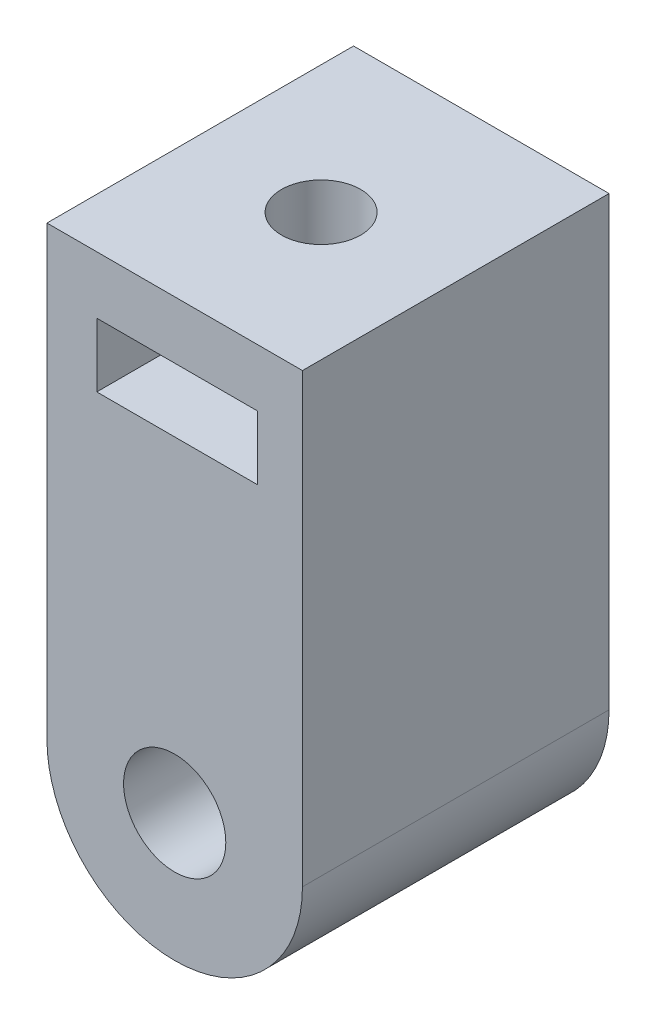
ISO-10303-21;
HEADER;
FILE_DESCRIPTION(('STEP AP214'),'2;1');
FILE_NAME('part.step','',(''),(''),'','','');
FILE_SCHEMA(('AUTOMOTIVE_DESIGN { 1 0 10303 214 1 1 1 1 }'));
ENDSEC;
DATA;
#1=APPLICATION_CONTEXT('core data for automotive mechanical design processes');
#2=APPLICATION_PROTOCOL_DEFINITION('international standard','automotive_design',2000,#1);
#3=PRODUCT_CONTEXT('',#1,'mechanical');
#4=PRODUCT('Part','Part','',(#3));
#5=PRODUCT_RELATED_PRODUCT_CATEGORY('part','',(#4));
#6=PRODUCT_DEFINITION_FORMATION('','',#4);
#7=PRODUCT_DEFINITION_CONTEXT('part definition',#1,'design');
#8=PRODUCT_DEFINITION('design','',#6,#7);
#9=PRODUCT_DEFINITION_SHAPE('','',#8);
#10=(LENGTH_UNIT() NAMED_UNIT(*) SI_UNIT(.MILLI.,.METRE.));
#11=(NAMED_UNIT(*) PLANE_ANGLE_UNIT() SI_UNIT($,.RADIAN.));
#12=(NAMED_UNIT(*) SI_UNIT($,.STERADIAN.) SOLID_ANGLE_UNIT());
#13=UNCERTAINTY_MEASURE_WITH_UNIT(LENGTH_MEASURE(1.E-05),#10,'distance_accuracy_value','');
#14=(GEOMETRIC_REPRESENTATION_CONTEXT(3) GLOBAL_UNCERTAINTY_ASSIGNED_CONTEXT((#13)) GLOBAL_UNIT_ASSIGNED_CONTEXT((#10,
#11,#12)) REPRESENTATION_CONTEXT('',''));
#15=CARTESIAN_POINT('',(0.,0.,0.));
#16=DIRECTION('',(0.,0.,1.));
#17=DIRECTION('',(1.,0.,0.));
#18=AXIS2_PLACEMENT_3D('',#15,#16,#17);
#19=CARTESIAN_POINT('',(0.,0.,12.));
#20=DIRECTION('',(0.,0.,1.));
#21=DIRECTION('',(1.,0.,0.));
#22=AXIS2_PLACEMENT_3D('',#19,#20,#21);
#23=PLANE('',#22);
#24=DIRECTION('',(0.,-1.,0.));
#25=VECTOR('',#24,1.);
#26=CARTESIAN_POINT('',(-3.05,15.25,12.));
#27=LINE('',#26,#25);
#28=CARTESIAN_POINT('',(-3.05,15.25,12.));
#29=VERTEX_POINT('',#28);
#30=CARTESIAN_POINT('',(-3.05,12.75,12.));
#31=VERTEX_POINT('',#30);
#32=EDGE_CURVE('E58',#29,#31,#27,.T.);
#33=ORIENTED_EDGE('',*,*,#32,.F.);
#34=DIRECTION('',(-1.,0.,0.));
#35=VECTOR('',#34,1.);
#36=CARTESIAN_POINT('',(3.25,15.25,12.));
#37=LINE('',#36,#35);
#38=CARTESIAN_POINT('',(3.25,15.25,12.));
#39=VERTEX_POINT('',#38);
#40=EDGE_CURVE('E169',#39,#29,#37,.T.);
#41=ORIENTED_EDGE('',*,*,#40,.F.);
#42=DIRECTION('',(0.,1.,0.));
#43=VECTOR('',#42,1.);
#44=CARTESIAN_POINT('',(3.25,15.25,12.));
#45=LINE('',#44,#43);
#46=CARTESIAN_POINT('',(3.25,12.75,12.));
#47=VERTEX_POINT('',#46);
#48=EDGE_CURVE('E183',#47,#39,#45,.T.);
#49=ORIENTED_EDGE('',*,*,#48,.F.);
#50=DIRECTION('',(1.,0.,0.));
#51=VECTOR('',#50,1.);
#52=CARTESIAN_POINT('',(3.25,12.75,12.));
#53=LINE('',#52,#51);
#54=EDGE_CURVE('E180',#31,#47,#53,.T.);
#55=ORIENTED_EDGE('',*,*,#54,.F.);
#56=EDGE_LOOP('',(#33,#41,#49,#55));
#57=FACE_BOUND('',#56,.T.);
#58=CARTESIAN_POINT('',(0.,0.,12.));
#59=DIRECTION('',(0.,0.,1.));
#60=DIRECTION('',(1.,0.,0.));
#61=AXIS2_PLACEMENT_3D('',#58,#59,#60);
#62=CIRCLE('',#61,2.);
#63=CARTESIAN_POINT('',(2.,0.,12.));
#64=VERTEX_POINT('',#63);
#65=EDGE_CURVE('E221',#64,#64,#62,.T.);
#66=ORIENTED_EDGE('',*,*,#65,.F.);
#67=EDGE_LOOP('',(#66));
#68=FACE_BOUND('',#67,.T.);
#69=DIRECTION('',(0.,-1.,0.));
#70=VECTOR('',#69,1.);
#71=CARTESIAN_POINT('',(-5.,0.,12.));
#72=LINE('',#71,#70);
#73=CARTESIAN_POINT('',(-5.,17.5,12.));
#74=VERTEX_POINT('',#73);
#75=CARTESIAN_POINT('',(-5.,0.,12.));
#76=VERTEX_POINT('',#75);
#77=EDGE_CURVE('E208',#74,#76,#72,.T.);
#78=ORIENTED_EDGE('',*,*,#77,.T.);
#79=CARTESIAN_POINT('',(0.,0.,12.));
#80=DIRECTION('',(0.,0.,1.));
#81=DIRECTION('',(1.,0.,0.));
#82=AXIS2_PLACEMENT_3D('',#79,#80,#81);
#83=CIRCLE('',#82,5.);
#84=CARTESIAN_POINT('',(5.,0.,12.));
#85=VERTEX_POINT('',#84);
#86=EDGE_CURVE('E11',#76,#85,#83,.T.);
#87=ORIENTED_EDGE('',*,*,#86,.T.);
#88=DIRECTION('',(0.,1.,0.));
#89=VECTOR('',#88,1.);
#90=CARTESIAN_POINT('',(5.,0.,12.));
#91=LINE('',#90,#89);
#92=CARTESIAN_POINT('',(5.,17.5,12.));
#93=VERTEX_POINT('',#92);
#94=EDGE_CURVE('E190',#85,#93,#91,.T.);
#95=ORIENTED_EDGE('',*,*,#94,.T.);
#96=DIRECTION('',(-1.,0.,0.));
#97=VECTOR('',#96,1.);
#98=CARTESIAN_POINT('',(-5.,17.5,12.));
#99=LINE('',#98,#97);
#100=EDGE_CURVE('E205',#93,#74,#99,.T.);
#101=ORIENTED_EDGE('',*,*,#100,.T.);
#102=EDGE_LOOP('',(#78,#87,#95,#101));
#103=FACE_BOUND('',#102,.T.);
#104=ADVANCED_FACE('F35',(#57,#68,#103),#23,.T.);
#105=CARTESIAN_POINT('',(0.,0.,0.));
#106=DIRECTION('',(0.,0.,1.));
#107=DIRECTION('',(1.,0.,0.));
#108=AXIS2_PLACEMENT_3D('',#105,#106,#107);
#109=PLANE('',#108);
#110=CARTESIAN_POINT('',(0.,0.,0.));
#111=DIRECTION('',(0.,0.,1.));
#112=DIRECTION('',(1.,0.,0.));
#113=AXIS2_PLACEMENT_3D('',#110,#111,#112);
#114=CIRCLE('',#113,2.);
#115=CARTESIAN_POINT('',(2.,0.,0.));
#116=VERTEX_POINT('',#115);
#117=EDGE_CURVE('E220',#116,#116,#114,.T.);
#118=ORIENTED_EDGE('',*,*,#117,.T.);
#119=EDGE_LOOP('',(#118));
#120=FACE_BOUND('',#119,.T.);
#121=CARTESIAN_POINT('',(0.,0.,0.));
#122=DIRECTION('',(0.,0.,1.));
#123=DIRECTION('',(1.,0.,0.));
#124=AXIS2_PLACEMENT_3D('',#121,#122,#123);
#125=CIRCLE('',#124,5.);
#126=CARTESIAN_POINT('',(-5.,0.,0.));
#127=VERTEX_POINT('',#126);
#128=CARTESIAN_POINT('',(5.,0.,0.));
#129=VERTEX_POINT('',#128);
#130=EDGE_CURVE('E39',#127,#129,#125,.T.);
#131=ORIENTED_EDGE('',*,*,#130,.F.);
#132=DIRECTION('',(0.,1.,0.));
#133=VECTOR('',#132,1.);
#134=CARTESIAN_POINT('',(-5.,0.,0.));
#135=LINE('',#134,#133);
#136=CARTESIAN_POINT('',(-5.,17.5,0.));
#137=VERTEX_POINT('',#136);
#138=EDGE_CURVE('E196',#127,#137,#135,.T.);
#139=ORIENTED_EDGE('',*,*,#138,.T.);
#140=DIRECTION('',(1.,0.,0.));
#141=VECTOR('',#140,1.);
#142=CARTESIAN_POINT('',(-5.,17.5,0.));
#143=LINE('',#142,#141);
#144=CARTESIAN_POINT('',(5.,17.5,0.));
#145=VERTEX_POINT('',#144);
#146=EDGE_CURVE('E202',#137,#145,#143,.T.);
#147=ORIENTED_EDGE('',*,*,#146,.T.);
#148=DIRECTION('',(0.,-1.,0.));
#149=VECTOR('',#148,1.);
#150=CARTESIAN_POINT('',(5.,0.,0.));
#151=LINE('',#150,#149);
#152=EDGE_CURVE('E198',#145,#129,#151,.T.);
#153=ORIENTED_EDGE('',*,*,#152,.T.);
#154=EDGE_LOOP('',(#131,#139,#147,#153));
#155=FACE_BOUND('',#154,.T.);
#156=ADVANCED_FACE('F227',(#120,#155),#109,.F.);
#157=CARTESIAN_POINT('',(0.,0.,12.));
#158=DIRECTION('',(0.,0.,-1.));
#159=DIRECTION('',(-1.,0.,0.));
#160=AXIS2_PLACEMENT_3D('',#157,#158,#159);
#161=CYLINDRICAL_SURFACE('',#160,5.);
#162=ORIENTED_EDGE('',*,*,#130,.T.);
#163=DIRECTION('',(0.,0.,1.));
#164=VECTOR('',#163,1.);
#165=CARTESIAN_POINT('',(5.,0.,-20.1556443707464));
#166=LINE('',#165,#164);
#167=EDGE_CURVE('E199',#129,#85,#166,.T.);
#168=ORIENTED_EDGE('',*,*,#167,.T.);
#169=ORIENTED_EDGE('',*,*,#86,.F.);
#170=DIRECTION('',(0.,0.,1.));
#171=VECTOR('',#170,1.);
#172=CARTESIAN_POINT('',(-5.,0.,-20.1556443707464));
#173=LINE('',#172,#171);
#174=EDGE_CURVE('E213',#127,#76,#173,.T.);
#175=ORIENTED_EDGE('',*,*,#174,.F.);
#176=EDGE_LOOP('',(#162,#168,#169,#175));
#177=FACE_BOUND('',#176,.T.);
#178=ADVANCED_FACE('F37',(#177),#161,.T.);
#179=CARTESIAN_POINT('',(0.,0.,12.));
#180=DIRECTION('',(0.,0.,-1.));
#181=DIRECTION('',(-1.,0.,0.));
#182=AXIS2_PLACEMENT_3D('',#179,#180,#181);
#183=CYLINDRICAL_SURFACE('',#182,2.);
#184=ORIENTED_EDGE('',*,*,#65,.T.);
#185=EDGE_LOOP('',(#184));
#186=FACE_BOUND('',#185,.T.);
#187=ORIENTED_EDGE('',*,*,#117,.F.);
#188=EDGE_LOOP('',(#187));
#189=FACE_BOUND('',#188,.T.);
#190=ADVANCED_FACE('F230',(#186,#189),#183,.F.);
#191=CARTESIAN_POINT('',(5.,0.,-20.1556443707464));
#192=DIRECTION('',(1.,0.,0.));
#193=DIRECTION('',(0.,1.,0.));
#194=AXIS2_PLACEMENT_3D('',#191,#192,#193);
#195=PLANE('',#194);
#196=ORIENTED_EDGE('',*,*,#152,.F.);
#197=DIRECTION('',(0.,0.,1.));
#198=VECTOR('',#197,1.);
#199=CARTESIAN_POINT('',(5.,17.5,-20.1556443707464));
#200=LINE('',#199,#198);
#201=EDGE_CURVE('E211',#145,#93,#200,.T.);
#202=ORIENTED_EDGE('',*,*,#201,.T.);
#203=ORIENTED_EDGE('',*,*,#94,.F.);
#204=ORIENTED_EDGE('',*,*,#167,.F.);
#205=EDGE_LOOP('',(#196,#202,#203,#204));
#206=FACE_BOUND('',#205,.T.);
#207=ADVANCED_FACE('F232',(#206),#195,.T.);
#208=CARTESIAN_POINT('',(-5.,0.,-20.1556443707464));
#209=DIRECTION('',(-1.,0.,0.));
#210=DIRECTION('',(0.,0.,1.));
#211=AXIS2_PLACEMENT_3D('',#208,#209,#210);
#212=PLANE('',#211);
#213=DIRECTION('',(0.,1.,0.));
#214=VECTOR('',#213,1.);
#215=CARTESIAN_POINT('',(-5.,2.925,11.09826702));
#216=LINE('',#215,#214);
#217=CARTESIAN_POINT('',(-5.,2.925,11.09826702));
#218=VERTEX_POINT('',#217);
#219=CARTESIAN_POINT('',(-5.,10.475,11.09826702));
#220=VERTEX_POINT('',#219);
#221=EDGE_CURVE('E50',#218,#220,#216,.T.);
#222=ORIENTED_EDGE('',*,*,#221,.F.);
#223=DIRECTION('',(0.,0.,1.));
#224=VECTOR('',#223,1.);
#225=CARTESIAN_POINT('',(-5.,2.925,1.44173298));
#226=LINE('',#225,#224);
#227=CARTESIAN_POINT('',(-5.,2.925,1.44173298));
#228=VERTEX_POINT('',#227);
#229=EDGE_CURVE('E144',#228,#218,#226,.T.);
#230=ORIENTED_EDGE('',*,*,#229,.F.);
#231=DIRECTION('',(0.,-1.,0.));
#232=VECTOR('',#231,1.);
#233=CARTESIAN_POINT('',(-5.,2.925,1.44173298));
#234=LINE('',#233,#232);
#235=CARTESIAN_POINT('',(-5.,10.475,1.44173298));
#236=VERTEX_POINT('',#235);
#237=EDGE_CURVE('E147',#236,#228,#234,.T.);
#238=ORIENTED_EDGE('',*,*,#237,.F.);
#239=DIRECTION('',(0.,0.,-1.));
#240=VECTOR('',#239,1.);
#241=CARTESIAN_POINT('',(-5.,10.475,1.44173298));
#242=LINE('',#241,#240);
#243=EDGE_CURVE('E156',#220,#236,#242,.T.);
#244=ORIENTED_EDGE('',*,*,#243,.F.);
#245=EDGE_LOOP('',(#222,#230,#238,#244));
#246=FACE_BOUND('',#245,.T.);
#247=ORIENTED_EDGE('',*,*,#138,.F.);
#248=ORIENTED_EDGE('',*,*,#174,.T.);
#249=ORIENTED_EDGE('',*,*,#77,.F.);
#250=DIRECTION('',(0.,0.,1.));
#251=VECTOR('',#250,1.);
#252=CARTESIAN_POINT('',(-5.,17.5,-20.1556443707464));
#253=LINE('',#252,#251);
#254=EDGE_CURVE('E216',#137,#74,#253,.T.);
#255=ORIENTED_EDGE('',*,*,#254,.F.);
#256=EDGE_LOOP('',(#247,#248,#249,#255));
#257=FACE_BOUND('',#256,.T.);
#258=ADVANCED_FACE('F239',(#246,#257),#212,.T.);
#259=CARTESIAN_POINT('',(-5.,17.5,-20.1556443707464));
#260=DIRECTION('',(0.,1.,0.));
#261=DIRECTION('',(0.,0.,1.));
#262=AXIS2_PLACEMENT_3D('',#259,#260,#261);
#263=PLANE('',#262);
#264=CARTESIAN_POINT('',(0.,17.5,6.27));
#265=DIRECTION('',(0.,1.,0.));
#266=DIRECTION('',(0.,0.,1.));
#267=AXIS2_PLACEMENT_3D('',#264,#265,#266);
#268=CIRCLE('',#267,1.55);
#269=CARTESIAN_POINT('',(0.,17.5,7.82));
#270=VERTEX_POINT('',#269);
#271=EDGE_CURVE('E321',#270,#270,#268,.T.);
#272=ORIENTED_EDGE('',*,*,#271,.F.);
#273=EDGE_LOOP('',(#272));
#274=FACE_BOUND('',#273,.T.);
#275=ORIENTED_EDGE('',*,*,#146,.F.);
#276=ORIENTED_EDGE('',*,*,#254,.T.);
#277=ORIENTED_EDGE('',*,*,#100,.F.);
#278=ORIENTED_EDGE('',*,*,#201,.F.);
#279=EDGE_LOOP('',(#275,#276,#277,#278));
#280=FACE_BOUND('',#279,.T.);
#281=ADVANCED_FACE('F266',(#274,#280),#263,.T.);
#282=CARTESIAN_POINT('',(-3.05,15.25,3.52));
#283=DIRECTION('',(-1.,0.,0.));
#284=DIRECTION('',(0.,-1.,0.));
#285=AXIS2_PLACEMENT_3D('',#282,#283,#284);
#286=PLANE('',#285);
#287=ORIENTED_EDGE('',*,*,#32,.T.);
#288=DIRECTION('',(0.,0.,1.));
#289=VECTOR('',#288,1.);
#290=CARTESIAN_POINT('',(-3.05,12.75,3.52));
#291=LINE('',#290,#289);
#292=CARTESIAN_POINT('',(-3.05,12.75,3.52));
#293=VERTEX_POINT('',#292);
#294=EDGE_CURVE('E178',#293,#31,#291,.T.);
#295=ORIENTED_EDGE('',*,*,#294,.F.);
#296=DIRECTION('',(0.,-1.,0.));
#297=VECTOR('',#296,1.);
#298=CARTESIAN_POINT('',(-3.05,15.25,3.52));
#299=LINE('',#298,#297);
#300=CARTESIAN_POINT('',(-3.05,15.25,3.52));
#301=VERTEX_POINT('',#300);
#302=EDGE_CURVE('E165',#301,#293,#299,.T.);
#303=ORIENTED_EDGE('',*,*,#302,.F.);
#304=DIRECTION('',(0.,0.,1.));
#305=VECTOR('',#304,1.);
#306=CARTESIAN_POINT('',(-3.05,15.25,3.52));
#307=LINE('',#306,#305);
#308=EDGE_CURVE('E188',#301,#29,#307,.T.);
#309=ORIENTED_EDGE('',*,*,#308,.T.);
#310=EDGE_LOOP('',(#287,#295,#303,#309));
#311=FACE_BOUND('',#310,.T.);
#312=ADVANCED_FACE('F268',(#311),#286,.F.);
#313=CARTESIAN_POINT('',(3.25,15.25,3.52));
#314=DIRECTION('',(0.,1.,0.));
#315=DIRECTION('',(0.,0.,1.));
#316=AXIS2_PLACEMENT_3D('',#313,#314,#315);
#317=PLANE('',#316);
#318=CARTESIAN_POINT('',(0.,15.25,6.27));
#319=DIRECTION('',(0.,1.,0.));
#320=DIRECTION('',(0.,0.,1.));
#321=AXIS2_PLACEMENT_3D('',#318,#319,#320);
#322=CIRCLE('',#321,1.55);
#323=CARTESIAN_POINT('',(0.,15.25,7.82));
#324=VERTEX_POINT('',#323);
#325=EDGE_CURVE('E150',#324,#324,#322,.T.);
#326=ORIENTED_EDGE('',*,*,#325,.T.);
#327=EDGE_LOOP('',(#326));
#328=FACE_BOUND('',#327,.T.);
#329=ORIENTED_EDGE('',*,*,#40,.T.);
#330=ORIENTED_EDGE('',*,*,#308,.F.);
#331=DIRECTION('',(-1.,0.,0.));
#332=VECTOR('',#331,1.);
#333=CARTESIAN_POINT('',(3.25,15.25,3.52));
#334=LINE('',#333,#332);
#335=CARTESIAN_POINT('',(3.25,15.25,3.52));
#336=VERTEX_POINT('',#335);
#337=EDGE_CURVE('E175',#336,#301,#334,.T.);
#338=ORIENTED_EDGE('',*,*,#337,.F.);
#339=DIRECTION('',(0.,0.,1.));
#340=VECTOR('',#339,1.);
#341=CARTESIAN_POINT('',(3.25,15.25,3.52));
#342=LINE('',#341,#340);
#343=EDGE_CURVE('E191',#336,#39,#342,.T.);
#344=ORIENTED_EDGE('',*,*,#343,.T.);
#345=EDGE_LOOP('',(#329,#330,#338,#344));
#346=FACE_BOUND('',#345,.T.);
#347=ADVANCED_FACE('F275',(#328,#346),#317,.F.);
#348=CARTESIAN_POINT('',(3.25,15.25,3.52));
#349=DIRECTION('',(1.,0.,0.));
#350=DIRECTION('',(0.,0.,-1.));
#351=AXIS2_PLACEMENT_3D('',#348,#349,#350);
#352=PLANE('',#351);
#353=ORIENTED_EDGE('',*,*,#48,.T.);
#354=ORIENTED_EDGE('',*,*,#343,.F.);
#355=DIRECTION('',(0.,1.,0.));
#356=VECTOR('',#355,1.);
#357=CARTESIAN_POINT('',(3.25,15.25,3.52));
#358=LINE('',#357,#356);
#359=CARTESIAN_POINT('',(3.25,12.75,3.52));
#360=VERTEX_POINT('',#359);
#361=EDGE_CURVE('E172',#360,#336,#358,.T.);
#362=ORIENTED_EDGE('',*,*,#361,.F.);
#363=DIRECTION('',(0.,0.,1.));
#364=VECTOR('',#363,1.);
#365=CARTESIAN_POINT('',(3.25,12.75,3.52));
#366=LINE('',#365,#364);
#367=EDGE_CURVE('E193',#360,#47,#366,.T.);
#368=ORIENTED_EDGE('',*,*,#367,.T.);
#369=EDGE_LOOP('',(#353,#354,#362,#368));
#370=FACE_BOUND('',#369,.T.);
#371=ADVANCED_FACE('F285',(#370),#352,.F.);
#372=CARTESIAN_POINT('',(3.25,12.75,3.52));
#373=DIRECTION('',(0.,-1.,0.));
#374=DIRECTION('',(0.,0.,-1.));
#375=AXIS2_PLACEMENT_3D('',#372,#373,#374);
#376=PLANE('',#375);
#377=CARTESIAN_POINT('',(0.,12.75,6.27));
#378=DIRECTION('',(0.,-1.,0.));
#379=DIRECTION('',(0.,0.,-1.));
#380=AXIS2_PLACEMENT_3D('',#377,#378,#379);
#381=CIRCLE('',#380,1.55);
#382=CARTESIAN_POINT('',(0.,12.75,4.72));
#383=VERTEX_POINT('',#382);
#384=EDGE_CURVE('E324',#383,#383,#381,.T.);
#385=ORIENTED_EDGE('',*,*,#384,.T.);
#386=EDGE_LOOP('',(#385));
#387=FACE_BOUND('',#386,.T.);
#388=ORIENTED_EDGE('',*,*,#54,.T.);
#389=ORIENTED_EDGE('',*,*,#367,.F.);
#390=DIRECTION('',(1.,0.,0.));
#391=VECTOR('',#390,1.);
#392=CARTESIAN_POINT('',(3.25,12.75,3.52));
#393=LINE('',#392,#391);
#394=EDGE_CURVE('E168',#293,#360,#393,.T.);
#395=ORIENTED_EDGE('',*,*,#394,.F.);
#396=ORIENTED_EDGE('',*,*,#294,.T.);
#397=EDGE_LOOP('',(#388,#389,#395,#396));
#398=FACE_BOUND('',#397,.T.);
#399=ADVANCED_FACE('F281',(#387,#398),#376,.F.);
#400=CARTESIAN_POINT('',(0.,0.,3.52));
#401=DIRECTION('',(0.,0.,-1.));
#402=DIRECTION('',(-1.,0.,0.));
#403=AXIS2_PLACEMENT_3D('',#400,#401,#402);
#404=PLANE('',#403);
#405=ORIENTED_EDGE('',*,*,#302,.T.);
#406=ORIENTED_EDGE('',*,*,#394,.T.);
#407=ORIENTED_EDGE('',*,*,#361,.T.);
#408=ORIENTED_EDGE('',*,*,#337,.T.);
#409=EDGE_LOOP('',(#405,#406,#407,#408));
#410=FACE_BOUND('',#409,.T.);
#411=ADVANCED_FACE('F284',(#410),#404,.F.);
#412=CARTESIAN_POINT('',(4.4,2.925,11.09826702));
#413=DIRECTION('',(0.,0.,1.));
#414=DIRECTION('',(0.,-1.,0.));
#415=AXIS2_PLACEMENT_3D('',#412,#413,#414);
#416=PLANE('',#415);
#417=ORIENTED_EDGE('',*,*,#221,.T.);
#418=DIRECTION('',(-1.,0.,0.));
#419=VECTOR('',#418,1.);
#420=CARTESIAN_POINT('',(4.4,10.475,11.09826702));
#421=LINE('',#420,#419);
#422=CARTESIAN_POINT('',(4.4,10.475,11.09826702));
#423=VERTEX_POINT('',#422);
#424=EDGE_CURVE('E122',#423,#220,#421,.T.);
#425=ORIENTED_EDGE('',*,*,#424,.F.);
#426=DIRECTION('',(0.,1.,0.));
#427=VECTOR('',#426,1.);
#428=CARTESIAN_POINT('',(4.4,2.925,11.09826702));
#429=LINE('',#428,#427);
#430=CARTESIAN_POINT('',(4.4,2.925,11.09826702));
#431=VERTEX_POINT('',#430);
#432=EDGE_CURVE('E126',#431,#423,#429,.T.);
#433=ORIENTED_EDGE('',*,*,#432,.F.);
#434=DIRECTION('',(-1.,0.,0.));
#435=VECTOR('',#434,1.);
#436=CARTESIAN_POINT('',(4.4,2.925,11.09826702));
#437=LINE('',#436,#435);
#438=EDGE_CURVE('E160',#431,#218,#437,.T.);
#439=ORIENTED_EDGE('',*,*,#438,.T.);
#440=EDGE_LOOP('',(#417,#425,#433,#439));
#441=FACE_BOUND('',#440,.T.);
#442=ADVANCED_FACE('F124',(#441),#416,.F.);
#443=CARTESIAN_POINT('',(4.4,2.925,1.44173298));
#444=DIRECTION('',(0.,-1.,0.));
#445=DIRECTION('',(0.,0.,-1.));
#446=AXIS2_PLACEMENT_3D('',#443,#444,#445);
#447=PLANE('',#446);
#448=ORIENTED_EDGE('',*,*,#229,.T.);
#449=ORIENTED_EDGE('',*,*,#438,.F.);
#450=DIRECTION('',(0.,0.,1.));
#451=VECTOR('',#450,1.);
#452=CARTESIAN_POINT('',(4.4,2.925,1.44173298));
#453=LINE('',#452,#451);
#454=CARTESIAN_POINT('',(4.4,2.925,1.44173298));
#455=VERTEX_POINT('',#454);
#456=EDGE_CURVE('E132',#455,#431,#453,.T.);
#457=ORIENTED_EDGE('',*,*,#456,.F.);
#458=DIRECTION('',(-1.,0.,0.));
#459=VECTOR('',#458,1.);
#460=CARTESIAN_POINT('',(4.4,2.925,1.44173298));
#461=LINE('',#460,#459);
#462=EDGE_CURVE('E162',#455,#228,#461,.T.);
#463=ORIENTED_EDGE('',*,*,#462,.T.);
#464=EDGE_LOOP('',(#448,#449,#457,#463));
#465=FACE_BOUND('',#464,.T.);
#466=ADVANCED_FACE('F298',(#465),#447,.F.);
#467=CARTESIAN_POINT('',(4.4,2.925,1.44173298));
#468=DIRECTION('',(0.,0.,-1.));
#469=DIRECTION('',(-1.,0.,0.));
#470=AXIS2_PLACEMENT_3D('',#467,#468,#469);
#471=PLANE('',#470);
#472=ORIENTED_EDGE('',*,*,#237,.T.);
#473=ORIENTED_EDGE('',*,*,#462,.F.);
#474=DIRECTION('',(0.,-1.,0.));
#475=VECTOR('',#474,1.);
#476=CARTESIAN_POINT('',(4.4,2.925,1.44173298));
#477=LINE('',#476,#475);
#478=CARTESIAN_POINT('',(4.4,10.475,1.44173298));
#479=VERTEX_POINT('',#478);
#480=EDGE_CURVE('E140',#479,#455,#477,.T.);
#481=ORIENTED_EDGE('',*,*,#480,.F.);
#482=DIRECTION('',(-1.,0.,0.));
#483=VECTOR('',#482,1.);
#484=CARTESIAN_POINT('',(4.4,10.475,1.44173298));
#485=LINE('',#484,#483);
#486=EDGE_CURVE('E131',#479,#236,#485,.T.);
#487=ORIENTED_EDGE('',*,*,#486,.T.);
#488=EDGE_LOOP('',(#472,#473,#481,#487));
#489=FACE_BOUND('',#488,.T.);
#490=ADVANCED_FACE('F301',(#489),#471,.F.);
#491=CARTESIAN_POINT('',(4.4,10.475,1.44173298));
#492=DIRECTION('',(0.,1.,0.));
#493=DIRECTION('',(0.,0.,1.));
#494=AXIS2_PLACEMENT_3D('',#491,#492,#493);
#495=PLANE('',#494);
#496=CARTESIAN_POINT('',(0.,10.475,6.27));
#497=DIRECTION('',(0.,1.,0.));
#498=DIRECTION('',(0.,0.,1.));
#499=AXIS2_PLACEMENT_3D('',#496,#497,#498);
#500=CIRCLE('',#499,1.55);
#501=CARTESIAN_POINT('',(0.,10.475,7.82));
#502=VERTEX_POINT('',#501);
#503=EDGE_CURVE('E326',#502,#502,#500,.F.);
#504=ORIENTED_EDGE('',*,*,#503,.F.);
#505=EDGE_LOOP('',(#504));
#506=FACE_BOUND('',#505,.T.);
#507=ORIENTED_EDGE('',*,*,#243,.T.);
#508=ORIENTED_EDGE('',*,*,#486,.F.);
#509=DIRECTION('',(0.,0.,-1.));
#510=VECTOR('',#509,1.);
#511=CARTESIAN_POINT('',(4.4,10.475,1.44173298));
#512=LINE('',#511,#510);
#513=EDGE_CURVE('E135',#423,#479,#512,.T.);
#514=ORIENTED_EDGE('',*,*,#513,.F.);
#515=ORIENTED_EDGE('',*,*,#424,.T.);
#516=EDGE_LOOP('',(#507,#508,#514,#515));
#517=FACE_BOUND('',#516,.T.);
#518=ADVANCED_FACE('F136',(#506,#517),#495,.F.);
#519=CARTESIAN_POINT('',(4.4,0.,0.));
#520=DIRECTION('',(1.,0.,0.));
#521=DIRECTION('',(0.,0.,-1.));
#522=AXIS2_PLACEMENT_3D('',#519,#520,#521);
#523=PLANE('',#522);
#524=ORIENTED_EDGE('',*,*,#432,.T.);
#525=ORIENTED_EDGE('',*,*,#513,.T.);
#526=ORIENTED_EDGE('',*,*,#480,.T.);
#527=ORIENTED_EDGE('',*,*,#456,.T.);
#528=EDGE_LOOP('',(#524,#525,#526,#527));
#529=FACE_BOUND('',#528,.T.);
#530=ADVANCED_FACE('F142',(#529),#523,.F.);
#531=CARTESIAN_POINT('',(0.,6.09093795664341,6.27));
#532=DIRECTION('',(0.,1.,0.));
#533=DIRECTION('',(0.,0.,1.));
#534=AXIS2_PLACEMENT_3D('',#531,#532,#533);
#535=CYLINDRICAL_SURFACE('',#534,1.55);
#536=ORIENTED_EDGE('',*,*,#503,.T.);
#537=EDGE_LOOP('',(#536));
#538=FACE_BOUND('',#537,.T.);
#539=ORIENTED_EDGE('',*,*,#384,.F.);
#540=EDGE_LOOP('',(#539));
#541=FACE_BOUND('',#540,.T.);
#542=ADVANCED_FACE('F311',(#538,#541),#535,.F.);
#543=ORIENTED_EDGE('',*,*,#271,.T.);
#544=EDGE_LOOP('',(#543));
#545=FACE_BOUND('',#544,.T.);
#546=ORIENTED_EDGE('',*,*,#325,.F.);
#547=EDGE_LOOP('',(#546));
#548=FACE_BOUND('',#547,.T.);
#549=ADVANCED_FACE('F312',(#545,#548),#535,.F.);
#550=CLOSED_SHELL('',(#104,#156,#178,#190,#207,#258,#281,#312,#347,#371,#399,#411,#442,#466,
#490,#518,#530,#542,#549));
#551=MANIFOLD_SOLID_BREP('B2',#550);
#552=ADVANCED_BREP_SHAPE_REPRESENTATION('',(#18,#551),#14);
#553=SHAPE_DEFINITION_REPRESENTATION(#9,#552);
ENDSEC;
END-ISO-10303-21;
